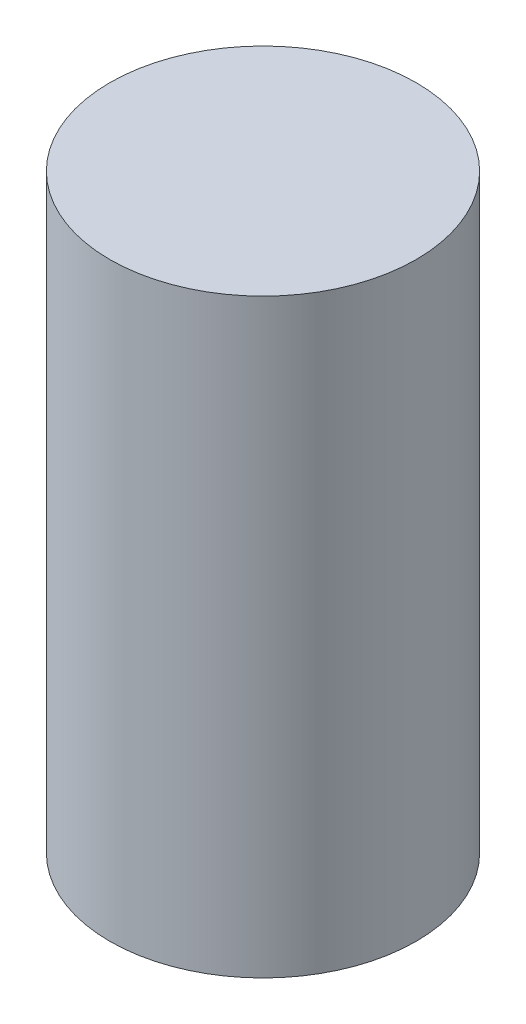
ISO-10303-21;
HEADER;
FILE_DESCRIPTION(('STEP AP214'),'2;1');
FILE_NAME('part.step','',(''),(''),'','','');
FILE_SCHEMA(('AUTOMOTIVE_DESIGN { 1 0 10303 214 1 1 1 1 }'));
ENDSEC;
DATA;
#1=APPLICATION_CONTEXT('core data for automotive mechanical design processes');
#2=APPLICATION_PROTOCOL_DEFINITION('international standard','automotive_design',2000,#1);
#3=PRODUCT_CONTEXT('',#1,'mechanical');
#4=PRODUCT('Part','Part','',(#3));
#5=PRODUCT_RELATED_PRODUCT_CATEGORY('part','',(#4));
#6=PRODUCT_DEFINITION_FORMATION('','',#4);
#7=PRODUCT_DEFINITION_CONTEXT('part definition',#1,'design');
#8=PRODUCT_DEFINITION('design','',#6,#7);
#9=PRODUCT_DEFINITION_SHAPE('','',#8);
#10=(LENGTH_UNIT() NAMED_UNIT(*) SI_UNIT(.MILLI.,.METRE.));
#11=(NAMED_UNIT(*) PLANE_ANGLE_UNIT() SI_UNIT($,.RADIAN.));
#12=(NAMED_UNIT(*) SI_UNIT($,.STERADIAN.) SOLID_ANGLE_UNIT());
#13=UNCERTAINTY_MEASURE_WITH_UNIT(LENGTH_MEASURE(1.E-05),#10,'distance_accuracy_value','');
#14=(GEOMETRIC_REPRESENTATION_CONTEXT(3) GLOBAL_UNCERTAINTY_ASSIGNED_CONTEXT((#13)) GLOBAL_UNIT_ASSIGNED_CONTEXT((#10,
#11,#12)) REPRESENTATION_CONTEXT('',''));
#15=CARTESIAN_POINT('',(0.,0.,0.));
#16=DIRECTION('',(0.,0.,1.));
#17=DIRECTION('',(1.,0.,0.));
#18=AXIS2_PLACEMENT_3D('',#15,#16,#17);
#19=CARTESIAN_POINT('',(0.,106.,0.));
#20=DIRECTION('',(0.,-1.,0.));
#21=DIRECTION('',(0.,0.,-1.));
#22=AXIS2_PLACEMENT_3D('',#19,#20,#21);
#23=CYLINDRICAL_SURFACE('',#22,27.5);
#24=CARTESIAN_POINT('',(0.,106.,0.));
#25=DIRECTION('',(0.,1.,0.));
#26=DIRECTION('',(0.,0.,1.));
#27=AXIS2_PLACEMENT_3D('',#24,#25,#26);
#28=CIRCLE('',#27,27.5);
#29=CARTESIAN_POINT('',(0.,106.,27.5));
#30=VERTEX_POINT('',#29);
#31=EDGE_CURVE('E10',#30,#30,#28,.T.);
#32=ORIENTED_EDGE('',*,*,#31,.F.);
#33=EDGE_LOOP('',(#32));
#34=FACE_BOUND('',#33,.T.);
#35=CARTESIAN_POINT('',(0.,0.,0.));
#36=DIRECTION('',(0.,1.,0.));
#37=DIRECTION('',(0.,0.,1.));
#38=AXIS2_PLACEMENT_3D('',#35,#36,#37);
#39=CIRCLE('',#38,27.5);
#40=CARTESIAN_POINT('',(0.,0.,27.5));
#41=VERTEX_POINT('',#40);
#42=EDGE_CURVE('E38',#41,#41,#39,.T.);
#43=ORIENTED_EDGE('',*,*,#42,.T.);
#44=EDGE_LOOP('',(#43));
#45=FACE_BOUND('',#44,.T.);
#46=ADVANCED_FACE('F35',(#34,#45),#23,.T.);
#47=CARTESIAN_POINT('',(0.,106.,0.));
#48=DIRECTION('',(0.,1.,0.));
#49=DIRECTION('',(0.,0.,1.));
#50=AXIS2_PLACEMENT_3D('',#47,#48,#49);
#51=PLANE('',#50);
#52=ORIENTED_EDGE('',*,*,#31,.T.);
#53=EDGE_LOOP('',(#52));
#54=FACE_BOUND('',#53,.T.);
#55=ADVANCED_FACE('F50',(#54),#51,.T.);
#56=CARTESIAN_POINT('',(0.,0.,0.));
#57=DIRECTION('',(0.,1.,0.));
#58=DIRECTION('',(0.,0.,1.));
#59=AXIS2_PLACEMENT_3D('',#56,#57,#58);
#60=PLANE('',#59);
#61=ORIENTED_EDGE('',*,*,#42,.F.);
#62=EDGE_LOOP('',(#61));
#63=FACE_BOUND('',#62,.T.);
#64=ADVANCED_FACE('F48',(#63),#60,.F.);
#65=CLOSED_SHELL('',(#46,#55,#64));
#66=MANIFOLD_SOLID_BREP('B2',#65);
#67=ADVANCED_BREP_SHAPE_REPRESENTATION('',(#18,#66),#14);
#68=SHAPE_DEFINITION_REPRESENTATION(#9,#67);
ENDSEC;
END-ISO-10303-21;
